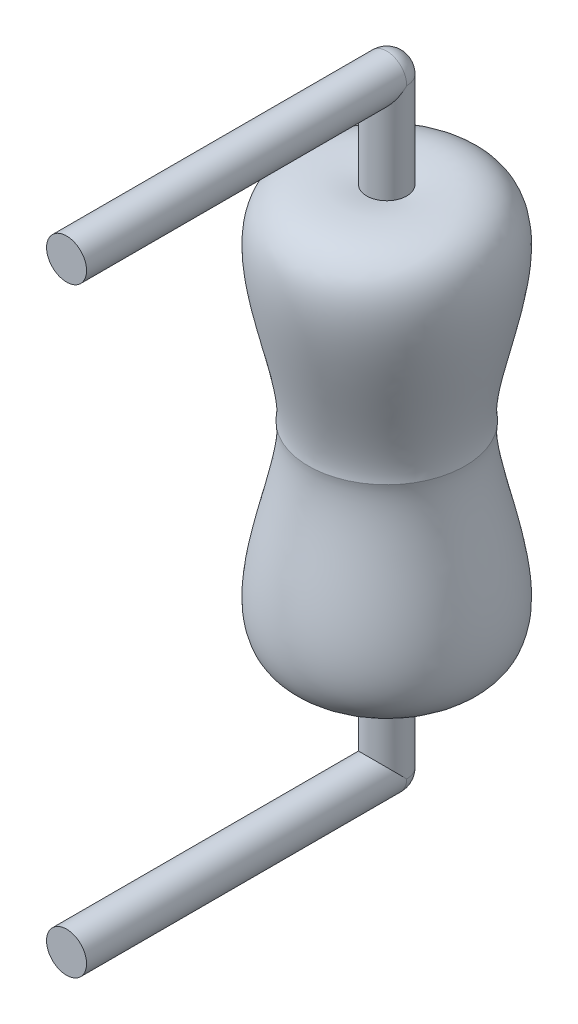
ISO-10303-21;
HEADER;
FILE_DESCRIPTION(('STEP AP214'),'2;1');
FILE_NAME('part.step','',(''),(''),'','','');
FILE_SCHEMA(('AUTOMOTIVE_DESIGN { 1 0 10303 214 1 1 1 1 }'));
ENDSEC;
DATA;
#1=APPLICATION_CONTEXT('core data for automotive mechanical design processes');
#2=APPLICATION_PROTOCOL_DEFINITION('international standard','automotive_design',2000,#1);
#3=PRODUCT_CONTEXT('',#1,'mechanical');
#4=PRODUCT('Part','Part','',(#3));
#5=PRODUCT_RELATED_PRODUCT_CATEGORY('part','',(#4));
#6=PRODUCT_DEFINITION_FORMATION('','',#4);
#7=PRODUCT_DEFINITION_CONTEXT('part definition',#1,'design');
#8=PRODUCT_DEFINITION('design','',#6,#7);
#9=PRODUCT_DEFINITION_SHAPE('','',#8);
#10=(LENGTH_UNIT() NAMED_UNIT(*) SI_UNIT(.MILLI.,.METRE.));
#11=(NAMED_UNIT(*) PLANE_ANGLE_UNIT() SI_UNIT($,.RADIAN.));
#12=(NAMED_UNIT(*) SI_UNIT($,.STERADIAN.) SOLID_ANGLE_UNIT());
#13=UNCERTAINTY_MEASURE_WITH_UNIT(LENGTH_MEASURE(1.E-05),#10,'distance_accuracy_value','');
#14=(GEOMETRIC_REPRESENTATION_CONTEXT(3) GLOBAL_UNCERTAINTY_ASSIGNED_CONTEXT((#13)) GLOBAL_UNIT_ASSIGNED_CONTEXT((#10,
#11,#12)) REPRESENTATION_CONTEXT('',''));
#15=CARTESIAN_POINT('',(0.,0.,0.));
#16=DIRECTION('',(0.,0.,1.));
#17=DIRECTION('',(1.,0.,0.));
#18=AXIS2_PLACEMENT_3D('',#15,#16,#17);
#19=CARTESIAN_POINT('',(0.,0.,0.));
#20=CARTESIAN_POINT('',(-2.21378353379612,-0.586931463551118,0.));
#21=CARTESIAN_POINT('',(-0.856458778845413,1.73315912157378,0.));
#22=CARTESIAN_POINT('',(-0.979154643077846,2.5,0.));
#23=B_SPLINE_CURVE_WITH_KNOTS('',3,(#19,#20,#21,#22),.UNSPECIFIED.,.F.,.F.,(4,4),(0.,1.),.UNSPECIFIED.);
#24=CARTESIAN_POINT('',(0.,0.,0.));
#25=DIRECTION('',(0.,-1.,0.));
#26=AXIS1_PLACEMENT('',#24,#25);
#27=SURFACE_OF_REVOLUTION('',#23,#26);
#28=CARTESIAN_POINT('',(0.,2.5,0.));
#29=DIRECTION('',(0.,-1.,0.));
#30=DIRECTION('',(0.,0.,-1.));
#31=AXIS2_PLACEMENT_3D('',#28,#29,#30);
#32=CIRCLE('',#31,0.979154643077846);
#33=CARTESIAN_POINT('',(0.,2.5,-0.979154643077846));
#34=VERTEX_POINT('',#33);
#35=EDGE_CURVE('E83',#34,#34,#32,.T.);
#36=ORIENTED_EDGE('',*,*,#35,.T.);
#37=EDGE_LOOP('',(#36));
#38=FACE_BOUND('',#37,.T.);
#39=CARTESIAN_POINT('',(0.,-0.0569806117275592,0.));
#40=DIRECTION('',(0.,-1.,0.));
#41=DIRECTION('',(0.,0.,-1.));
#42=AXIS2_PLACEMENT_3D('',#39,#40,#41);
#43=CIRCLE('',#42,0.25);
#44=CARTESIAN_POINT('',(0.,-0.0569806117275592,-0.25));
#45=VERTEX_POINT('',#44);
#46=EDGE_CURVE('E43',#45,#45,#43,.T.);
#47=ORIENTED_EDGE('',*,*,#46,.F.);
#48=EDGE_LOOP('',(#47));
#49=FACE_BOUND('',#48,.T.);
#50=ADVANCED_FACE('F35',(#38,#49),#27,.F.);
#51=CARTESIAN_POINT('',(0.,0.,0.));
#52=DIRECTION('',(0.,-1.,0.));
#53=DIRECTION('',(0.,0.,-1.));
#54=AXIS2_PLACEMENT_3D('',#51,#52,#53);
#55=CYLINDRICAL_SURFACE('',#54,0.25);
#56=CARTESIAN_POINT('',(0.,-1.25,0.));
#57=DIRECTION('',(0.,-1.,0.));
#58=DIRECTION('',(0.,0.,-1.));
#59=AXIS2_PLACEMENT_3D('',#56,#57,#58);
#60=CIRCLE('',#59,0.25);
#61=CARTESIAN_POINT('',(-0.25,-1.25,0.));
#62=VERTEX_POINT('',#61);
#63=CARTESIAN_POINT('',(0.25,-1.25,0.));
#64=VERTEX_POINT('',#63);
#65=EDGE_CURVE('E54',#62,#64,#60,.T.);
#66=ORIENTED_EDGE('',*,*,#65,.F.);
#67=CARTESIAN_POINT('',(0.,-1.25,0.));
#68=DIRECTION('',(0.,-0.707106781186547,0.707106781186547));
#69=DIRECTION('',(0.,-0.707106781186547,-0.707106781186547));
#70=AXIS2_PLACEMENT_3D('',#67,#68,#69);
#71=ELLIPSE('',#70,0.353553390593274,0.25);
#72=EDGE_CURVE('E82',#62,#64,#71,.F.);
#73=ORIENTED_EDGE('',*,*,#72,.T.);
#74=EDGE_LOOP('',(#66,#73));
#75=FACE_BOUND('',#74,.T.);
#76=ORIENTED_EDGE('',*,*,#46,.T.);
#77=EDGE_LOOP('',(#76));
#78=FACE_BOUND('',#77,.T.);
#79=ADVANCED_FACE('F109',(#75,#78),#55,.T.);
#80=CARTESIAN_POINT('',(0.,0.,0.));
#81=DIRECTION('',(0.,-1.,0.));
#82=DIRECTION('',(0.,0.,-1.));
#83=AXIS2_PLACEMENT_3D('',#80,#81,#82);
#84=CYLINDRICAL_SURFACE('',#83,0.25);
#85=CARTESIAN_POINT('',(0.,6.25,0.));
#86=DIRECTION('',(0.,-0.707106781186547,-0.707106781186547));
#87=DIRECTION('',(0.,-0.707106781186547,0.707106781186547));
#88=AXIS2_PLACEMENT_3D('',#85,#86,#87);
#89=ELLIPSE('',#88,0.353553390593274,0.25);
#90=CARTESIAN_POINT('',(-0.25,6.25,0.));
#91=VERTEX_POINT('',#90);
#92=CARTESIAN_POINT('',(0.25,6.25,0.));
#93=VERTEX_POINT('',#92);
#94=EDGE_CURVE('E11',#91,#93,#89,.F.);
#95=ORIENTED_EDGE('',*,*,#94,.F.);
#96=CARTESIAN_POINT('',(0.,6.25,0.));
#97=DIRECTION('',(0.,-1.,0.));
#98=DIRECTION('',(0.,0.,-1.));
#99=AXIS2_PLACEMENT_3D('',#96,#97,#98);
#100=CIRCLE('',#99,0.25);
#101=EDGE_CURVE('E59',#91,#93,#100,.T.);
#102=ORIENTED_EDGE('',*,*,#101,.T.);
#103=EDGE_LOOP('',(#95,#102));
#104=FACE_BOUND('',#103,.T.);
#105=CARTESIAN_POINT('',(0.,5.05698061172756,0.));
#106=DIRECTION('',(0.,-1.,0.));
#107=DIRECTION('',(0.,0.,-1.));
#108=AXIS2_PLACEMENT_3D('',#105,#106,#107);
#109=CIRCLE('',#108,0.25);
#110=CARTESIAN_POINT('',(0.,5.05698061172756,-0.25));
#111=VERTEX_POINT('',#110);
#112=EDGE_CURVE('E65',#111,#111,#109,.T.);
#113=ORIENTED_EDGE('',*,*,#112,.F.);
#114=EDGE_LOOP('',(#113));
#115=FACE_BOUND('',#114,.T.);
#116=ADVANCED_FACE('F60',(#104,#115),#84,.T.);
#117=CARTESIAN_POINT('',(0.,5.,0.));
#118=CARTESIAN_POINT('',(-2.21378353379613,5.58693146355112,0.));
#119=CARTESIAN_POINT('',(-0.856458778845413,3.26684087842622,0.));
#120=CARTESIAN_POINT('',(-0.979154643077846,2.5,0.));
#121=B_SPLINE_CURVE_WITH_KNOTS('',3,(#117,#118,#119,#120),.UNSPECIFIED.,.F.,.F.,(4,4),(0.,1.),.UNSPECIFIED.);
#122=CARTESIAN_POINT('',(0.,0.,0.));
#123=DIRECTION('',(0.,-1.,0.));
#124=AXIS1_PLACEMENT('',#122,#123);
#125=SURFACE_OF_REVOLUTION('',#121,#124);
#126=ORIENTED_EDGE('',*,*,#35,.F.);
#127=EDGE_LOOP('',(#126));
#128=FACE_BOUND('',#127,.T.);
#129=ORIENTED_EDGE('',*,*,#112,.T.);
#130=EDGE_LOOP('',(#129));
#131=FACE_BOUND('',#130,.T.);
#132=ADVANCED_FACE('F100',(#128,#131),#125,.T.);
#133=CARTESIAN_POINT('',(0.,-1.25,0.));
#134=DIRECTION('',(0.,0.,-1.));
#135=DIRECTION('',(-1.,0.,0.));
#136=AXIS2_PLACEMENT_3D('',#133,#134,#135);
#137=CYLINDRICAL_SURFACE('',#136,0.25);
#138=CARTESIAN_POINT('',(0.,-1.25,4.));
#139=DIRECTION('',(0.,0.,-1.));
#140=DIRECTION('',(-1.,0.,0.));
#141=AXIS2_PLACEMENT_3D('',#138,#139,#140);
#142=CIRCLE('',#141,0.25);
#143=CARTESIAN_POINT('',(-0.25,-1.25,4.));
#144=VERTEX_POINT('',#143);
#145=EDGE_CURVE('E71',#144,#144,#142,.T.);
#146=ORIENTED_EDGE('',*,*,#145,.T.);
#147=EDGE_LOOP('',(#146));
#148=FACE_BOUND('',#147,.T.);
#149=ORIENTED_EDGE('',*,*,#72,.F.);
#150=CARTESIAN_POINT('',(0.,-1.25,0.));
#151=DIRECTION('',(0.,0.,-1.));
#152=DIRECTION('',(-1.,0.,0.));
#153=AXIS2_PLACEMENT_3D('',#150,#151,#152);
#154=CIRCLE('',#153,0.25);
#155=EDGE_CURVE('E75',#64,#62,#154,.T.);
#156=ORIENTED_EDGE('',*,*,#155,.F.);
#157=EDGE_LOOP('',(#149,#156));
#158=FACE_BOUND('',#157,.T.);
#159=ADVANCED_FACE('F104',(#148,#158),#137,.T.);
#160=CARTESIAN_POINT('',(0.,-1.25,0.));
#161=DIRECTION('',(0.,0.,-1.));
#162=DIRECTION('',(-1.,0.,0.));
#163=AXIS2_PLACEMENT_3D('',#160,#161,#162);
#164=SPHERICAL_SURFACE('',#163,0.25);
#165=ORIENTED_EDGE('',*,*,#155,.T.);
#166=ORIENTED_EDGE('',*,*,#65,.T.);
#167=EDGE_LOOP('',(#165,#166));
#168=FACE_BOUND('',#167,.T.);
#169=ADVANCED_FACE('F106',(#168),#164,.T.);
#170=CARTESIAN_POINT('',(0.,-1.25,4.));
#171=DIRECTION('',(0.,0.,-1.));
#172=DIRECTION('',(-1.,0.,0.));
#173=AXIS2_PLACEMENT_3D('',#170,#171,#172);
#174=PLANE('',#173);
#175=ORIENTED_EDGE('',*,*,#145,.F.);
#176=EDGE_LOOP('',(#175));
#177=FACE_BOUND('',#176,.T.);
#178=ADVANCED_FACE('F133',(#177),#174,.F.);
#179=CARTESIAN_POINT('',(0.,6.25,0.));
#180=DIRECTION('',(0.,0.,-1.));
#181=DIRECTION('',(1.,0.,0.));
#182=AXIS2_PLACEMENT_3D('',#179,#180,#181);
#183=SPHERICAL_SURFACE('',#182,0.25);
#184=ORIENTED_EDGE('',*,*,#101,.F.);
#185=CARTESIAN_POINT('',(0.,6.25,0.));
#186=DIRECTION('',(0.,0.,-1.));
#187=DIRECTION('',(-1.,0.,0.));
#188=AXIS2_PLACEMENT_3D('',#185,#186,#187);
#189=CIRCLE('',#188,0.25);
#190=EDGE_CURVE('E69',#91,#93,#189,.T.);
#191=ORIENTED_EDGE('',*,*,#190,.T.);
#192=EDGE_LOOP('',(#184,#191));
#193=FACE_BOUND('',#192,.T.);
#194=ADVANCED_FACE('F70',(#193),#183,.T.);
#195=CARTESIAN_POINT('',(0.,6.25,0.));
#196=DIRECTION('',(0.,0.,-1.));
#197=DIRECTION('',(-1.,0.,0.));
#198=AXIS2_PLACEMENT_3D('',#195,#196,#197);
#199=CYLINDRICAL_SURFACE('',#198,0.25);
#200=CARTESIAN_POINT('',(0.,6.25,4.));
#201=DIRECTION('',(0.,0.,-1.));
#202=DIRECTION('',(-1.,0.,0.));
#203=AXIS2_PLACEMENT_3D('',#200,#201,#202);
#204=CIRCLE('',#203,0.25);
#205=CARTESIAN_POINT('',(-0.25,6.25,4.));
#206=VERTEX_POINT('',#205);
#207=EDGE_CURVE('E72',#206,#206,#204,.T.);
#208=ORIENTED_EDGE('',*,*,#207,.T.);
#209=EDGE_LOOP('',(#208));
#210=FACE_BOUND('',#209,.T.);
#211=ORIENTED_EDGE('',*,*,#190,.F.);
#212=ORIENTED_EDGE('',*,*,#94,.T.);
#213=EDGE_LOOP('',(#211,#212));
#214=FACE_BOUND('',#213,.T.);
#215=ADVANCED_FACE('F68',(#210,#214),#199,.T.);
#216=CARTESIAN_POINT('',(0.,6.25,4.));
#217=DIRECTION('',(0.,0.,-1.));
#218=DIRECTION('',(-1.,0.,0.));
#219=AXIS2_PLACEMENT_3D('',#216,#217,#218);
#220=PLANE('',#219);
#221=ORIENTED_EDGE('',*,*,#207,.F.);
#222=EDGE_LOOP('',(#221));
#223=FACE_BOUND('',#222,.T.);
#224=ADVANCED_FACE('F142',(#223),#220,.F.);
#225=CLOSED_SHELL('',(#50,#79,#116,#132,#159,#169,#178,#194,#215,#224));
#226=MANIFOLD_SOLID_BREP('B2',#225);
#227=ADVANCED_BREP_SHAPE_REPRESENTATION('',(#18,#226),#14);
#228=SHAPE_DEFINITION_REPRESENTATION(#9,#227);
ENDSEC;
END-ISO-10303-21;
